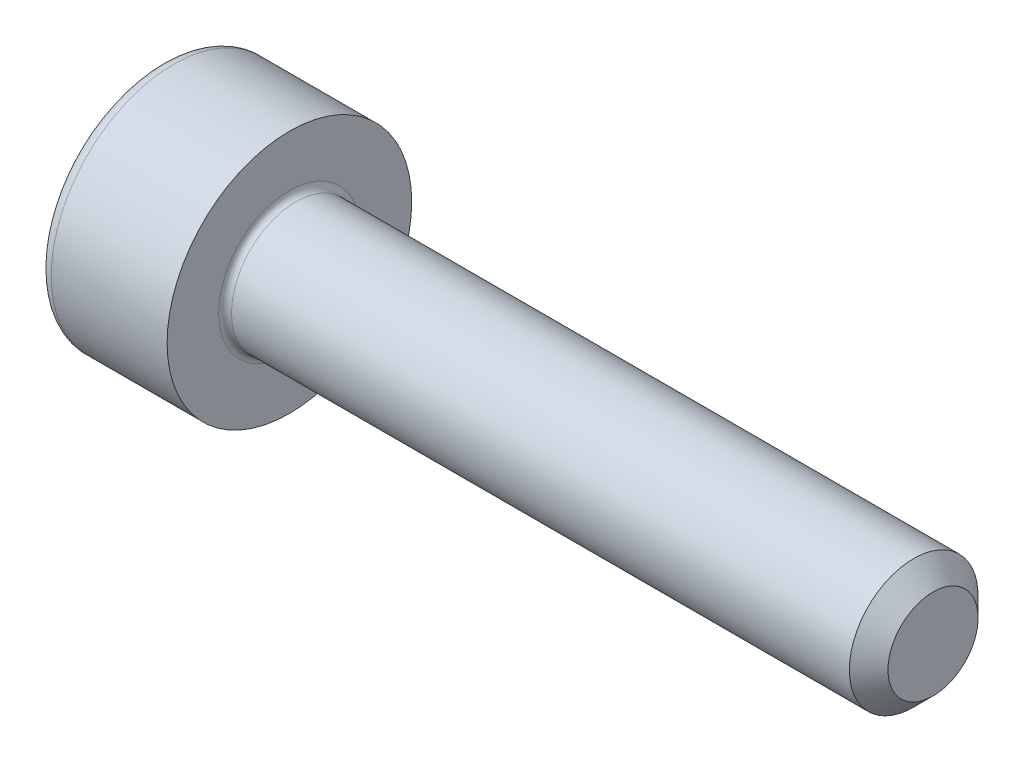
ISO-10303-21;
HEADER;
FILE_DESCRIPTION(('STEP AP214'),'2;1');
FILE_NAME('part.step','',(''),(''),'','','');
FILE_SCHEMA(('AUTOMOTIVE_DESIGN { 1 0 10303 214 1 1 1 1 }'));
ENDSEC;
DATA;
#1=APPLICATION_CONTEXT('core data for automotive mechanical design processes');
#2=APPLICATION_PROTOCOL_DEFINITION('international standard','automotive_design',2000,#1);
#3=PRODUCT_CONTEXT('',#1,'mechanical');
#4=PRODUCT('Part','Part','',(#3));
#5=PRODUCT_RELATED_PRODUCT_CATEGORY('part','',(#4));
#6=PRODUCT_DEFINITION_FORMATION('','',#4);
#7=PRODUCT_DEFINITION_CONTEXT('part definition',#1,'design');
#8=PRODUCT_DEFINITION('design','',#6,#7);
#9=PRODUCT_DEFINITION_SHAPE('','',#8);
#10=(LENGTH_UNIT() NAMED_UNIT(*) SI_UNIT(.MILLI.,.METRE.));
#11=(NAMED_UNIT(*) PLANE_ANGLE_UNIT() SI_UNIT($,.RADIAN.));
#12=(NAMED_UNIT(*) SI_UNIT($,.STERADIAN.) SOLID_ANGLE_UNIT());
#13=UNCERTAINTY_MEASURE_WITH_UNIT(LENGTH_MEASURE(1.E-05),#10,'distance_accuracy_value','');
#14=(GEOMETRIC_REPRESENTATION_CONTEXT(3) GLOBAL_UNCERTAINTY_ASSIGNED_CONTEXT((#13)) GLOBAL_UNIT_ASSIGNED_CONTEXT((#10,
#11,#12)) REPRESENTATION_CONTEXT('',''));
#15=CARTESIAN_POINT('',(0.,0.,0.));
#16=DIRECTION('',(0.,0.,1.));
#17=DIRECTION('',(1.,0.,0.));
#18=AXIS2_PLACEMENT_3D('',#15,#16,#17);
#19=CARTESIAN_POINT('',(-2.,0.,0.));
#20=DIRECTION('',(-1.,0.,0.));
#21=DIRECTION('',(0.,1.,0.));
#22=AXIS2_PLACEMENT_3D('',#19,#20,#21);
#23=PLANE('',#22);
#24=CARTESIAN_POINT('',(-2.,0.,0.));
#25=DIRECTION('',(1.,0.,0.));
#26=DIRECTION('',(0.,1.,0.));
#27=AXIS2_PLACEMENT_3D('',#24,#25,#26);
#28=CIRCLE('',#27,1.7);
#29=CARTESIAN_POINT('',(-2.,1.7,0.));
#30=VERTEX_POINT('',#29);
#31=EDGE_CURVE('E10',#30,#30,#28,.T.);
#32=ORIENTED_EDGE('',*,*,#31,.F.);
#33=EDGE_LOOP('',(#32));
#34=FACE_BOUND('',#33,.T.);
#35=DIRECTION('',(0.,0.500000000000005,-0.866025403784436));
#36=VECTOR('',#35,1.);
#37=CARTESIAN_POINT('',(-2.,0.433012701892217,0.750000000000003));
#38=LINE('',#37,#36);
#39=CARTESIAN_POINT('',(-2.,0.433012701892217,0.750000000000004));
#40=VERTEX_POINT('',#39);
#41=CARTESIAN_POINT('',(-2.,0.866025403784441,0.));
#42=VERTEX_POINT('',#41);
#43=EDGE_CURVE('E23',#40,#42,#38,.T.);
#44=ORIENTED_EDGE('',*,*,#43,.F.);
#45=DIRECTION('',(0.,1.,0.));
#46=VECTOR('',#45,1.);
#47=CARTESIAN_POINT('',(-2.,-0.433012701892221,0.750000000000003));
#48=LINE('',#47,#46);
#49=CARTESIAN_POINT('',(-2.,-0.433012701892221,0.750000000000003));
#50=VERTEX_POINT('',#49);
#51=EDGE_CURVE('E183',#50,#40,#48,.T.);
#52=ORIENTED_EDGE('',*,*,#51,.F.);
#53=DIRECTION('',(0.,0.499999999999999,0.866025403784439));
#54=VECTOR('',#53,1.);
#55=CARTESIAN_POINT('',(-2.,-0.86602540378444,0.));
#56=LINE('',#55,#54);
#57=CARTESIAN_POINT('',(-2.,-0.86602540378444,0.));
#58=VERTEX_POINT('',#57);
#59=EDGE_CURVE('E225',#58,#50,#56,.T.);
#60=ORIENTED_EDGE('',*,*,#59,.F.);
#61=DIRECTION('',(0.,-0.499999999999999,0.866025403784439));
#62=VECTOR('',#61,1.);
#63=CARTESIAN_POINT('',(-2.,-0.43301270189222,-0.750000000000001));
#64=LINE('',#63,#62);
#65=CARTESIAN_POINT('',(-2.,-0.433012701892221,-0.750000000000001));
#66=VERTEX_POINT('',#65);
#67=EDGE_CURVE('E132',#66,#58,#64,.T.);
#68=ORIENTED_EDGE('',*,*,#67,.F.);
#69=DIRECTION('',(0.,-1.,0.));
#70=VECTOR('',#69,1.);
#71=CARTESIAN_POINT('',(-2.,0.433012701892219,-0.749999999999998));
#72=LINE('',#71,#70);
#73=CARTESIAN_POINT('',(-2.,0.433012701892219,-0.749999999999998));
#74=VERTEX_POINT('',#73);
#75=EDGE_CURVE('E116',#74,#66,#72,.T.);
#76=ORIENTED_EDGE('',*,*,#75,.F.);
#77=DIRECTION('',(0.,-0.5,-0.866025403784439));
#78=VECTOR('',#77,1.);
#79=CARTESIAN_POINT('',(-2.,0.866025403784441,0.));
#80=LINE('',#79,#78);
#81=EDGE_CURVE('E110',#42,#74,#80,.T.);
#82=ORIENTED_EDGE('',*,*,#81,.F.);
#83=EDGE_LOOP('',(#44,#52,#60,#68,#76,#82));
#84=FACE_BOUND('',#83,.T.);
#85=ADVANCED_FACE('F16',(#34,#84),#23,.T.);
#86=CARTESIAN_POINT('',(-1.,0.,0.));
#87=DIRECTION('',(-1.,0.,0.));
#88=DIRECTION('',(0.,0.,1.));
#89=AXIS2_PLACEMENT_3D('',#86,#87,#88);
#90=CONICAL_SURFACE('',#89,0.866025403784438,1.0471975511966);
#91=CARTESIAN_POINT('',(-0.5,0.,0.));
#92=VERTEX_POINT('',#91);
#93=VERTEX_LOOP('',#92);
#94=FACE_BOUND('',#93,.T.);
#95=CARTESIAN_POINT('',(-0.933012701892204,0.,0.749999999999973));
#96=CARTESIAN_POINT('',(-0.933008833544879,0.0199213912756084,0.750000000000135));
#97=CARTESIAN_POINT('',(-0.933470994729893,0.0398405243523647,0.750000000000083));
#98=CARTESIAN_POINT('',(-0.935296784596608,0.0796264841816474,0.749999999999923));
#99=CARTESIAN_POINT('',(-0.936659909026974,0.0994933339552711,0.749999999999815));
#100=CARTESIAN_POINT('',(-0.94115593553694,0.149058236469928,0.749999999999938));
#101=CARTESIAN_POINT('',(-0.944832841581887,0.178707735224105,0.750000000000364));
#102=CARTESIAN_POINT('',(-0.953950481546132,0.237746808839611,0.749999999999642));
#103=CARTESIAN_POINT('',(-0.959392256286227,0.267136219783089,0.749999999998492));
#104=CARTESIAN_POINT('',(-0.970471226698135,0.319354671321508,0.749999999998111));
#105=CARTESIAN_POINT('',(-0.975819293302447,0.34224623989559,0.749999999998523));
#106=CARTESIAN_POINT('',(-0.987328994472387,0.387797508754008,0.750000000001483));
#107=CARTESIAN_POINT('',(-0.993489716114358,0.410457438925144,0.750000000004029));
#108=CARTESIAN_POINT('',(-1.,0.433012701878141,0.750000000008129));
#109=B_SPLINE_CURVE_WITH_KNOTS('',3,(#95,#96,#97,#98,#99,#100,#101,#102,#103,#104,#105,#106,
#107,#108),.UNSPECIFIED.,.F.,.F.,(4,2,2,2,2,2,4),(0.,0.059754808156758,0.119476201014601,
0.209043066262145,0.298662849379751,0.369171648737575,0.439601903682821),.UNSPECIFIED.);
#110=CARTESIAN_POINT('',(-0.933012701892221,0.,0.750000000000003));
#111=VERTEX_POINT('',#110);
#112=CARTESIAN_POINT('',(-0.999999999994507,0.433012701892217,0.750000000000004));
#113=VERTEX_POINT('',#112);
#114=EDGE_CURVE('E178',#111,#113,#109,.T.);
#115=ORIENTED_EDGE('',*,*,#114,.T.);
#116=CARTESIAN_POINT('',(-0.999999999997254,0.433012701887088,0.750000000002964));
#117=CARTESIAN_POINT('',(-0.993725594986995,0.44388203395943,0.731173764614613));
#118=CARTESIAN_POINT('',(-0.987775954947516,0.454799336624101,0.712264441718613));
#119=CARTESIAN_POINT('',(-0.976625475516025,0.476743748583125,0.674255605263011));
#120=CARTESIAN_POINT('',(-0.971425607529809,0.48777098088496,0.655155878648199));
#121=CARTESIAN_POINT('',(-0.959509689755132,0.515452172117026,0.607210649023551));
#122=CARTESIAN_POINT('',(-0.95333332833011,0.532165892430157,0.578261636265314));
#123=CARTESIAN_POINT('',(-0.943287736785978,0.565757815373363,0.520078718984595));
#124=CARTESIAN_POINT('',(-0.939417119088209,0.582635912853792,0.490844996586663));
#125=CARTESIAN_POINT('',(-0.933854884639651,0.619142178043651,0.427614290527316));
#126=CARTESIAN_POINT('',(-0.932598487714664,0.63878779243049,0.393587088350106));
#127=CARTESIAN_POINT('',(-0.933670888553846,0.678054088190912,0.325575868879079));
#128=CARTESIAN_POINT('',(-0.936000004780061,0.69767476719484,0.29159185568959));
#129=CARTESIAN_POINT('',(-0.94689156440335,0.750725165162678,0.19970586964693));
#130=CARTESIAN_POINT('',(-0.958722645304518,0.783985416881427,0.142097422205928));
#131=CARTESIAN_POINT('',(-0.981909295146268,0.833330188524845,0.0566297714484034));
#132=CARTESIAN_POINT('',(-0.990586361201697,0.849746087684786,0.0281966008665968));
#133=CARTESIAN_POINT('',(-0.999999999999389,0.86602540378444,-1.07214963685674E-11));
#134=B_SPLINE_CURVE_WITH_KNOTS('',3,(#116,#117,#118,#119,#120,#121,#122,#123,#124,#125,#126,
#127,#128,#129,#130,#131,#132,#133),.UNSPECIFIED.,.F.,.F.,(4,2,2,2,2,2,2,2,4),(0.,
0.0678778965122259,0.135842960401226,0.237750158057644,0.339595966637661,0.457362799036722,
0.575140091983207,0.77723010535451,0.879016706592094),.UNSPECIFIED.);
#135=CARTESIAN_POINT('',(-0.999999999998778,0.866025403784441,0.));
#136=VERTEX_POINT('',#135);
#137=EDGE_CURVE('E164',#113,#136,#134,.T.);
#138=ORIENTED_EDGE('',*,*,#137,.T.);
#139=CARTESIAN_POINT('',(-0.999999999999389,0.86602540378444,-1.9263149996095E-12));
#140=CARTESIAN_POINT('',(-0.993725594987899,0.855156071716782,-0.0188262353877419));
#141=CARTESIAN_POINT('',(-0.987775954948481,0.844238769054009,-0.0377355582799994));
#142=CARTESIAN_POINT('',(-0.976625475518107,0.82229435709808,-0.0757443947279822));
#143=CARTESIAN_POINT('',(-0.971425607532947,0.811267124797441,-0.0948441213389177));
#144=CARTESIAN_POINT('',(-0.959509689759815,0.783585933572798,-0.142789350957965));
#145=CARTESIAN_POINT('',(-0.953333328334982,0.766872213268472,-0.171738363715886));
#146=CARTESIAN_POINT('',(-0.943287736790654,0.733280290313264,-0.229921280978897));
#147=CARTESIAN_POINT('',(-0.939417119092502,0.716402192812047,-0.259155003359448));
#148=CARTESIAN_POINT('',(-0.933854884641243,0.679895927658915,-0.322385709443386));
#149=CARTESIAN_POINT('',(-0.93259848771494,0.660250313343309,-0.356412911670596));
#150=CARTESIAN_POINT('',(-0.933670888552937,0.620984017411546,-0.424424131060475));
#151=CARTESIAN_POINT('',(-0.936000004779282,0.601363338165015,-0.458408144118799));
#152=CARTESIAN_POINT('',(-0.94689156440336,0.548312938980402,-0.550294129467752));
#153=CARTESIAN_POINT('',(-0.958722645304526,0.5150526858833,-0.60790257611293));
#154=CARTESIAN_POINT('',(-0.981909295146271,0.465707914947231,-0.693370227278804));
#155=CARTESIAN_POINT('',(-0.990586361201698,0.449292016493224,-0.721803398268172));
#156=CARTESIAN_POINT('',(-0.999999999999388,0.433012701882926,-0.750000000005365));
#157=B_SPLINE_CURVE_WITH_KNOTS('',3,(#139,#140,#141,#142,#143,#144,#145,#146,#147,#148,#149,
#150,#151,#152,#153,#154,#155,#156),.UNSPECIFIED.,.F.,.F.,(4,2,2,2,2,2,2,2,4),(0.,
0.0678778965000533,0.135842960376759,0.237750158019345,0.339595966585644,0.457362799007784,
0.575140091977281,0.777230105348513,0.879016706586076),.UNSPECIFIED.);
#158=CARTESIAN_POINT('',(-0.999999999998775,0.433012701892219,-0.749999999999998));
#159=VERTEX_POINT('',#158);
#160=EDGE_CURVE('E150',#136,#159,#157,.T.);
#161=ORIENTED_EDGE('',*,*,#160,.T.);
#162=CARTESIAN_POINT('',(-0.999999999999388,0.433012701890549,-0.750000000000963));
#163=CARTESIAN_POINT('',(-0.9937255949879,0.411274037754983,-0.750000000001111));
#164=CARTESIAN_POINT('',(-0.987775954948483,0.389439432430544,-0.750000000000475));
#165=CARTESIAN_POINT('',(-0.976625475518111,0.345550608520348,-0.749999999999521));
#166=CARTESIAN_POINT('',(-0.971425607532951,0.323496143919626,-0.749999999999203));
#167=CARTESIAN_POINT('',(-0.959509689759821,0.268133761466942,-0.750000000001171));
#168=CARTESIAN_POINT('',(-0.953333328334989,0.234706320851946,-0.750000000004837));
#169=CARTESIAN_POINT('',(-0.943287736790661,0.1675224749583,-0.749999999995164));
#170=CARTESIAN_POINT('',(-0.939417119092509,0.133766279978958,-0.749999999981834));
#171=CARTESIAN_POINT('',(-0.933854884641246,0.0607537496344794,-0.750000000003901));
#172=CARTESIAN_POINT('',(-0.932598487714941,0.0214625209281991,-0.75000000004724));
#173=CARTESIAN_POINT('',(-0.933670888552935,-0.0570700707716807,-0.749999999952755));
#174=CARTESIAN_POINT('',(-0.936000004779278,-0.0963114290259993,-0.749999999814915));
#175=CARTESIAN_POINT('',(-0.946891564403355,-0.202412226182275,-0.749999999114611));
#176=CARTESIAN_POINT('',(-0.95872264530452,-0.268932730998118,-0.749999998318811));
#177=CARTESIAN_POINT('',(-0.981909295146268,-0.367622273577602,-0.749999998727188));
#178=CARTESIAN_POINT('',(-0.990586361201696,-0.400454071191554,-0.749999999134757));
#179=CARTESIAN_POINT('',(-0.999999999999388,-0.433012701901512,-0.749999999994636));
#180=B_SPLINE_CURVE_WITH_KNOTS('',3,(#162,#163,#164,#165,#166,#167,#168,#169,#170,#171,#172,
#173,#174,#175,#176,#177,#178,#179),.UNSPECIFIED.,.F.,.F.,(4,2,2,2,2,2,2,2,4),(0.,
0.0678778965000383,0.135842960376729,0.237750158019295,0.339595966585576,0.457362799007724,
0.575140091977229,0.777230105348485,0.879016706586073),.UNSPECIFIED.);
#181=CARTESIAN_POINT('',(-0.999999999998777,-0.433012701892221,-0.750000000000001));
#182=VERTEX_POINT('',#181);
#183=EDGE_CURVE('E125',#159,#182,#180,.T.);
#184=ORIENTED_EDGE('',*,*,#183,.T.);
#185=CARTESIAN_POINT('',(-0.999999999999388,-0.433012701893893,-0.749999999999034));
#186=CARTESIAN_POINT('',(-0.993725594987898,-0.443882033961809,-0.731173764613362));
#187=CARTESIAN_POINT('',(-0.987775954948478,-0.454799336623482,-0.712264441720464));
#188=CARTESIAN_POINT('',(-0.976625475518102,-0.476743748577763,-0.674255605271519));
#189=CARTESIAN_POINT('',(-0.971425607532941,-0.487770980877854,-0.655155878660261));
#190=CARTESIAN_POINT('',(-0.959509689759808,-0.515452172105912,-0.607210649043171));
#191=CARTESIAN_POINT('',(-0.953333328334974,-0.532165892416592,-0.578261636288909));
#192=CARTESIAN_POINT('',(-0.943287736790646,-0.565757815355052,-0.52007871901621));
#193=CARTESIAN_POINT('',(-0.939417119092496,-0.582635912833186,-0.490844996622323));
#194=CARTESIAN_POINT('',(-0.933854884641239,-0.619142178024548,-0.427614290560433));
#195=CARTESIAN_POINT('',(-0.932598487714939,-0.638787792415225,-0.393587088376551));
#196=CARTESIAN_POINT('',(-0.933670888552943,-0.678054088183349,-0.325575868892165));
#197=CARTESIAN_POINT('',(-0.936000004779293,-0.69767476719114,-0.291591855695991));
#198=CARTESIAN_POINT('',(-0.946891564403382,-0.750725165162782,-0.199705869646749));
#199=CARTESIAN_POINT('',(-0.958722645304547,-0.783985416881501,-0.142097422205796));
#200=CARTESIAN_POINT('',(-0.981909295146284,-0.833330188524874,-0.0566297714483446));
#201=CARTESIAN_POINT('',(-0.990586361201705,-0.849746087684799,-0.0281966008665637));
#202=CARTESIAN_POINT('',(-0.999999999999388,-0.866025403784439,1.07311981421065E-11));
#203=B_SPLINE_CURVE_WITH_KNOTS('',3,(#185,#186,#187,#188,#189,#190,#191,#192,#193,#194,#195,
#196,#197,#198,#199,#200,#201,#202),.UNSPECIFIED.,.F.,.F.,(4,2,2,2,2,2,2,2,4),(0.,
0.0678778965000681,0.135842960376788,0.237750158019398,0.339595966585721,0.457362799007898,
0.575140091977433,0.777230105348577,0.879016706586072),.UNSPECIFIED.);
#204=CARTESIAN_POINT('',(-0.999999999998777,-0.86602540378444,0.));
#205=VERTEX_POINT('',#204);
#206=EDGE_CURVE('E157',#182,#205,#203,.T.);
#207=ORIENTED_EDGE('',*,*,#206,.T.);
#208=CARTESIAN_POINT('',(-0.999999999999388,-0.866025403784439,1.93411096122033E-12));
#209=CARTESIAN_POINT('',(-0.9937255949879,-0.855156071716783,0.0188262353877477));
#210=CARTESIAN_POINT('',(-0.987775954948482,-0.844238769054011,0.0377355582800032));
#211=CARTESIAN_POINT('',(-0.976625475518109,-0.822294357098084,0.0757443947279829));
#212=CARTESIAN_POINT('',(-0.971425607532949,-0.811267124797445,0.0948441213389174));
#213=CARTESIAN_POINT('',(-0.959509689759818,-0.783585933572804,0.142789350957962));
#214=CARTESIAN_POINT('',(-0.953333328334986,-0.766872213268478,0.171738363715882));
#215=CARTESIAN_POINT('',(-0.943287736790656,-0.733280290313272,0.22992128097889));
#216=CARTESIAN_POINT('',(-0.939417119092502,-0.716402192812056,0.259155003359439));
#217=CARTESIAN_POINT('',(-0.93385488464125,-0.679895927658923,0.322385709443379));
#218=CARTESIAN_POINT('',(-0.932598487714961,-0.660250313343315,0.356412911670594));
#219=CARTESIAN_POINT('',(-0.93367088855292,-0.620984017411546,0.424424131060482));
#220=CARTESIAN_POINT('',(-0.93600000477921,-0.601363338165012,0.458408144118811));
#221=CARTESIAN_POINT('',(-0.946891564403489,-0.548312938980411,0.550294129467742));
#222=CARTESIAN_POINT('',(-0.95872264530516,-0.515052685883359,0.607902576112836));
#223=CARTESIAN_POINT('',(-0.981909295145933,-0.465707914947253,0.693370227278773));
#224=CARTESIAN_POINT('',(-0.990586361200703,-0.449292016493269,0.721803398268102));
#225=CARTESIAN_POINT('',(-0.999999999997254,-0.43301270188293,0.750000000005365));
#226=B_SPLINE_CURVE_WITH_KNOTS('',3,(#208,#209,#210,#211,#212,#213,#214,#215,#216,#217,#218,
#219,#220,#221,#222,#223,#224,#225),.UNSPECIFIED.,.F.,.F.,(4,2,2,2,2,2,2,2,4),(0.,
0.0678778965000461,0.135842960376748,0.237750158019329,0.33959596658562,0.457362799007785,
0.575140091977258,0.777230105348594,0.879016706585525),.UNSPECIFIED.);
#227=CARTESIAN_POINT('',(-0.999999999994508,-0.433012701892221,0.750000000000003));
#228=VERTEX_POINT('',#227);
#229=EDGE_CURVE('E171',#205,#228,#226,.T.);
#230=ORIENTED_EDGE('',*,*,#229,.T.);
#231=CARTESIAN_POINT('',(-0.999999999997254,-0.433012701878144,0.750000000008128));
#232=CARTESIAN_POINT('',(-0.990556996500291,-0.400285242719805,0.750000000002961));
#233=CARTESIAN_POINT('',(-0.981842849756315,-0.367328249887462,0.750000000000806));
#234=CARTESIAN_POINT('',(-0.96628677907055,-0.301139660804241,0.749999999999203));
#235=CARTESIAN_POINT('',(-0.959436379461823,-0.267910040547365,0.749999999999742));
#236=CARTESIAN_POINT('',(-0.947036724027862,-0.195879816811318,0.750000000000258));
#237=CARTESIAN_POINT('',(-0.941853350505028,-0.157013533752798,0.750000000000135));
#238=CARTESIAN_POINT('',(-0.934806333523548,-0.0787766988136589,0.74999999999987));
#239=CARTESIAN_POINT('',(-0.932960632852675,-0.039404560661845,0.749999999999728));
#240=CARTESIAN_POINT('',(-0.933012701892204,0.,0.749999999999973));
#241=B_SPLINE_CURVE_WITH_KNOTS('',3,(#231,#232,#233,#234,#235,#236,#237,#238,#239,#240),
.UNSPECIFIED.,.F.,.F.,(4,2,2,2,4),(0.,0.102205558125607,0.203938242263253,0.321428325826841,
0.439548160359031),.UNSPECIFIED.);
#242=EDGE_CURVE('E182',#228,#111,#241,.T.);
#243=ORIENTED_EDGE('',*,*,#242,.T.);
#244=EDGE_LOOP('',(#115,#138,#161,#184,#207,#230,#243));
#245=FACE_BOUND('',#244,.T.);
#246=ADVANCED_FACE('F138',(#94,#245),#90,.F.);
#247=CARTESIAN_POINT('',(0.5,-0.433012701892221,0.750000000000003));
#248=DIRECTION('',(0.,0.,1.));
#249=DIRECTION('',(0.,1.,0.));
#250=AXIS2_PLACEMENT_3D('',#247,#248,#249);
#251=PLANE('',#250);
#252=ORIENTED_EDGE('',*,*,#242,.F.);
#253=DIRECTION('',(-1.,0.,0.));
#254=VECTOR('',#253,1.);
#255=CARTESIAN_POINT('',(-0.999999999994508,-0.433012701892221,0.750000000000003));
#256=LINE('',#255,#254);
#257=EDGE_CURVE('E221',#228,#50,#256,.T.);
#258=ORIENTED_EDGE('',*,*,#257,.T.);
#259=ORIENTED_EDGE('',*,*,#51,.T.);
#260=DIRECTION('',(-1.,0.,0.));
#261=VECTOR('',#260,1.);
#262=CARTESIAN_POINT('',(-0.999999999994507,0.433012701892217,0.750000000000004));
#263=LINE('',#262,#261);
#264=EDGE_CURVE('E119',#113,#40,#263,.T.);
#265=ORIENTED_EDGE('',*,*,#264,.F.);
#266=ORIENTED_EDGE('',*,*,#114,.F.);
#267=EDGE_LOOP('',(#252,#258,#259,#265,#266));
#268=FACE_BOUND('',#267,.T.);
#269=ADVANCED_FACE('F142',(#268),#251,.F.);
#270=CARTESIAN_POINT('',(0.5,-0.86602540378444,0.));
#271=DIRECTION('',(0.,-0.866025403784439,0.5));
#272=DIRECTION('',(0.,0.5,0.866025403784439));
#273=AXIS2_PLACEMENT_3D('',#270,#271,#272);
#274=PLANE('',#273);
#275=ORIENTED_EDGE('',*,*,#229,.F.);
#276=DIRECTION('',(-1.,0.,0.));
#277=VECTOR('',#276,1.);
#278=CARTESIAN_POINT('',(-0.999999999998777,-0.86602540378444,0.));
#279=LINE('',#278,#277);
#280=EDGE_CURVE('E228',#205,#58,#279,.T.);
#281=ORIENTED_EDGE('',*,*,#280,.T.);
#282=ORIENTED_EDGE('',*,*,#59,.T.);
#283=ORIENTED_EDGE('',*,*,#257,.F.);
#284=EDGE_LOOP('',(#275,#281,#282,#283));
#285=FACE_BOUND('',#284,.T.);
#286=ADVANCED_FACE('F189',(#285),#274,.F.);
#287=CARTESIAN_POINT('',(0.5,-0.433012701892221,-0.750000000000001));
#288=DIRECTION('',(0.,-0.866025403784439,-0.499999999999999));
#289=DIRECTION('',(0.,-0.499999999999999,0.866025403784439));
#290=AXIS2_PLACEMENT_3D('',#287,#288,#289);
#291=PLANE('',#290);
#292=ORIENTED_EDGE('',*,*,#206,.F.);
#293=DIRECTION('',(-1.,0.,0.));
#294=VECTOR('',#293,1.);
#295=CARTESIAN_POINT('',(-0.999999999998777,-0.433012701892221,-0.750000000000001));
#296=LINE('',#295,#294);
#297=EDGE_CURVE('E122',#182,#66,#296,.T.);
#298=ORIENTED_EDGE('',*,*,#297,.T.);
#299=ORIENTED_EDGE('',*,*,#67,.T.);
#300=ORIENTED_EDGE('',*,*,#280,.F.);
#301=EDGE_LOOP('',(#292,#298,#299,#300));
#302=FACE_BOUND('',#301,.T.);
#303=ADVANCED_FACE('F200',(#302),#291,.F.);
#304=CARTESIAN_POINT('',(0.5,0.433012701892219,-0.749999999999998));
#305=DIRECTION('',(0.,0.,-1.));
#306=DIRECTION('',(0.,-1.,0.));
#307=AXIS2_PLACEMENT_3D('',#304,#305,#306);
#308=PLANE('',#307);
#309=ORIENTED_EDGE('',*,*,#183,.F.);
#310=DIRECTION('',(-1.,0.,0.));
#311=VECTOR('',#310,1.);
#312=CARTESIAN_POINT('',(-0.999999999998775,0.433012701892219,-0.749999999999998));
#313=LINE('',#312,#311);
#314=EDGE_CURVE('E113',#159,#74,#313,.T.);
#315=ORIENTED_EDGE('',*,*,#314,.T.);
#316=ORIENTED_EDGE('',*,*,#75,.T.);
#317=ORIENTED_EDGE('',*,*,#297,.F.);
#318=EDGE_LOOP('',(#309,#315,#316,#317));
#319=FACE_BOUND('',#318,.T.);
#320=ADVANCED_FACE('F134',(#319),#308,.F.);
#321=CARTESIAN_POINT('',(0.5,0.866025403784441,0.));
#322=DIRECTION('',(0.,0.866025403784439,-0.5));
#323=DIRECTION('',(0.,-0.5,-0.866025403784439));
#324=AXIS2_PLACEMENT_3D('',#321,#322,#323);
#325=PLANE('',#324);
#326=ORIENTED_EDGE('',*,*,#160,.F.);
#327=DIRECTION('',(-1.,0.,0.));
#328=VECTOR('',#327,1.);
#329=CARTESIAN_POINT('',(-0.999999999998778,0.866025403784441,0.));
#330=LINE('',#329,#328);
#331=EDGE_CURVE('E107',#136,#42,#330,.T.);
#332=ORIENTED_EDGE('',*,*,#331,.T.);
#333=ORIENTED_EDGE('',*,*,#81,.T.);
#334=ORIENTED_EDGE('',*,*,#314,.F.);
#335=EDGE_LOOP('',(#326,#332,#333,#334));
#336=FACE_BOUND('',#335,.T.);
#337=ADVANCED_FACE('F196',(#336),#325,.F.);
#338=CARTESIAN_POINT('',(0.5,0.433012701892217,0.750000000000004));
#339=DIRECTION('',(0.,0.866025403784436,0.500000000000005));
#340=DIRECTION('',(0.,0.500000000000005,-0.866025403784436));
#341=AXIS2_PLACEMENT_3D('',#338,#339,#340);
#342=PLANE('',#341);
#343=ORIENTED_EDGE('',*,*,#137,.F.);
#344=ORIENTED_EDGE('',*,*,#264,.T.);
#345=ORIENTED_EDGE('',*,*,#43,.T.);
#346=ORIENTED_EDGE('',*,*,#331,.F.);
#347=EDGE_LOOP('',(#343,#344,#345,#346));
#348=FACE_BOUND('',#347,.T.);
#349=ADVANCED_FACE('F191',(#348),#342,.F.);
#350=CARTESIAN_POINT('',(-2.,0.,0.));
#351=DIRECTION('',(1.,0.,0.));
#352=DIRECTION('',(0.,1.,0.));
#353=AXIS2_PLACEMENT_3D('',#350,#351,#352);
#354=CYLINDRICAL_SURFACE('',#353,1.9);
#355=CARTESIAN_POINT('',(0.,0.,0.));
#356=DIRECTION('',(1.,0.,0.));
#357=DIRECTION('',(0.,1.,0.));
#358=AXIS2_PLACEMENT_3D('',#355,#356,#357);
#359=CIRCLE('',#358,1.9);
#360=CARTESIAN_POINT('',(0.,1.9,0.));
#361=VERTEX_POINT('',#360);
#362=EDGE_CURVE('E104',#361,#361,#359,.T.);
#363=ORIENTED_EDGE('',*,*,#362,.F.);
#364=EDGE_LOOP('',(#363));
#365=FACE_BOUND('',#364,.T.);
#366=CARTESIAN_POINT('',(-1.8,0.,0.));
#367=DIRECTION('',(1.,0.,0.));
#368=DIRECTION('',(0.,1.,0.));
#369=AXIS2_PLACEMENT_3D('',#366,#367,#368);
#370=CIRCLE('',#369,1.9);
#371=CARTESIAN_POINT('',(-1.8,1.9,0.));
#372=VERTEX_POINT('',#371);
#373=EDGE_CURVE('E102',#372,#372,#370,.T.);
#374=ORIENTED_EDGE('',*,*,#373,.T.);
#375=EDGE_LOOP('',(#374));
#376=FACE_BOUND('',#375,.T.);
#377=ADVANCED_FACE('F195',(#365,#376),#354,.T.);
#378=CARTESIAN_POINT('',(0.,0.,0.));
#379=DIRECTION('',(1.,0.,0.));
#380=DIRECTION('',(0.,1.,0.));
#381=AXIS2_PLACEMENT_3D('',#378,#379,#380);
#382=PLANE('',#381);
#383=ORIENTED_EDGE('',*,*,#362,.T.);
#384=EDGE_LOOP('',(#383));
#385=FACE_BOUND('',#384,.T.);
#386=CARTESIAN_POINT('',(0.,0.,0.));
#387=DIRECTION('',(1.,0.,0.));
#388=DIRECTION('',(0.,0.,1.));
#389=AXIS2_PLACEMENT_3D('',#386,#387,#388);
#390=CIRCLE('',#389,1.1);
#391=CARTESIAN_POINT('',(0.,0.,1.1));
#392=VERTEX_POINT('',#391);
#393=EDGE_CURVE('E94',#392,#392,#390,.T.);
#394=ORIENTED_EDGE('',*,*,#393,.F.);
#395=EDGE_LOOP('',(#394));
#396=FACE_BOUND('',#395,.T.);
#397=ADVANCED_FACE('F243',(#385,#396),#382,.T.);
#398=CARTESIAN_POINT('',(0.,0.,0.));
#399=DIRECTION('',(1.,0.,0.));
#400=DIRECTION('',(0.,0.,1.));
#401=AXIS2_PLACEMENT_3D('',#398,#399,#400);
#402=CYLINDRICAL_SURFACE('',#401,1.);
#403=CARTESIAN_POINT('',(9.7,0.,0.));
#404=DIRECTION('',(1.,0.,0.));
#405=DIRECTION('',(0.,0.,1.));
#406=AXIS2_PLACEMENT_3D('',#403,#404,#405);
#407=CIRCLE('',#406,1.);
#408=CARTESIAN_POINT('',(9.7,0.,1.));
#409=VERTEX_POINT('',#408);
#410=EDGE_CURVE('E99',#409,#409,#407,.T.);
#411=ORIENTED_EDGE('',*,*,#410,.F.);
#412=EDGE_LOOP('',(#411));
#413=FACE_BOUND('',#412,.T.);
#414=CARTESIAN_POINT('',(0.1,0.,0.));
#415=DIRECTION('',(1.,0.,0.));
#416=DIRECTION('',(0.,0.,1.));
#417=AXIS2_PLACEMENT_3D('',#414,#415,#416);
#418=CIRCLE('',#417,1.);
#419=CARTESIAN_POINT('',(0.1,0.,1.));
#420=VERTEX_POINT('',#419);
#421=EDGE_CURVE('E88',#420,#420,#418,.T.);
#422=ORIENTED_EDGE('',*,*,#421,.T.);
#423=EDGE_LOOP('',(#422));
#424=FACE_BOUND('',#423,.T.);
#425=ADVANCED_FACE('F89',(#413,#424),#402,.T.);
#426=CARTESIAN_POINT('',(9.7,0.,0.));
#427=DIRECTION('',(-1.,0.,0.));
#428=DIRECTION('',(0.,0.,1.));
#429=AXIS2_PLACEMENT_3D('',#426,#427,#428);
#430=CONICAL_SURFACE('',#429,1.,0.785398163397447);
#431=CARTESIAN_POINT('',(10.,0.,0.));
#432=DIRECTION('',(1.,0.,0.));
#433=DIRECTION('',(0.,0.,1.));
#434=AXIS2_PLACEMENT_3D('',#431,#432,#433);
#435=CIRCLE('',#434,0.7);
#436=CARTESIAN_POINT('',(10.,0.,0.7));
#437=VERTEX_POINT('',#436);
#438=EDGE_CURVE('E91',#437,#437,#435,.T.);
#439=ORIENTED_EDGE('',*,*,#438,.F.);
#440=EDGE_LOOP('',(#439));
#441=FACE_BOUND('',#440,.T.);
#442=ORIENTED_EDGE('',*,*,#410,.T.);
#443=EDGE_LOOP('',(#442));
#444=FACE_BOUND('',#443,.T.);
#445=ADVANCED_FACE('F250',(#441,#444),#430,.T.);
#446=CARTESIAN_POINT('',(10.,0.,0.));
#447=DIRECTION('',(1.,0.,0.));
#448=DIRECTION('',(0.,0.,1.));
#449=AXIS2_PLACEMENT_3D('',#446,#447,#448);
#450=PLANE('',#449);
#451=ORIENTED_EDGE('',*,*,#438,.T.);
#452=EDGE_LOOP('',(#451));
#453=FACE_BOUND('',#452,.T.);
#454=ADVANCED_FACE('F254',(#453),#450,.T.);
#455=CARTESIAN_POINT('',(-1.8,0.,0.));
#456=DIRECTION('',(1.,0.,0.));
#457=DIRECTION('',(0.,1.,0.));
#458=AXIS2_PLACEMENT_3D('',#455,#456,#457);
#459=TOROIDAL_SURFACE('',#458,1.7,0.2);
#460=ORIENTED_EDGE('',*,*,#373,.F.);
#461=EDGE_LOOP('',(#460));
#462=FACE_BOUND('',#461,.T.);
#463=ORIENTED_EDGE('',*,*,#31,.T.);
#464=EDGE_LOOP('',(#463));
#465=FACE_BOUND('',#464,.T.);
#466=ADVANCED_FACE('F143',(#462,#465),#459,.T.);
#467=CARTESIAN_POINT('',(0.1,0.,0.));
#468=DIRECTION('',(1.,0.,0.));
#469=DIRECTION('',(0.,0.,1.));
#470=AXIS2_PLACEMENT_3D('',#467,#468,#469);
#471=TOROIDAL_SURFACE('',#470,1.1,0.1);
#472=ORIENTED_EDGE('',*,*,#421,.F.);
#473=EDGE_LOOP('',(#472));
#474=FACE_BOUND('',#473,.T.);
#475=ORIENTED_EDGE('',*,*,#393,.T.);
#476=EDGE_LOOP('',(#475));
#477=FACE_BOUND('',#476,.T.);
#478=ADVANCED_FACE('F256',(#474,#477),#471,.F.);
#479=CLOSED_SHELL('',(#85,#246,#269,#286,#303,#320,#337,#349,#377,#397,#425,#445,#454,#466,#478));
#480=MANIFOLD_SOLID_BREP('B1',#479);
#481=ADVANCED_BREP_SHAPE_REPRESENTATION('',(#18,#480),#14);
#482=SHAPE_DEFINITION_REPRESENTATION(#9,#481);
ENDSEC;
END-ISO-10303-21;
